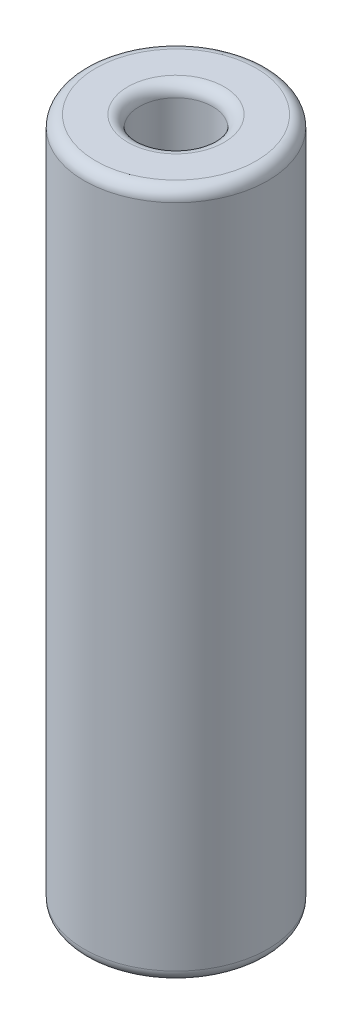
ISO-10303-21;
HEADER;
FILE_DESCRIPTION(('STEP AP214'),'2;1');
FILE_NAME('part.step','',(''),(''),'','','');
FILE_SCHEMA(('AUTOMOTIVE_DESIGN { 1 0 10303 214 1 1 1 1 }'));
ENDSEC;
DATA;
#1=APPLICATION_CONTEXT('core data for automotive mechanical design processes');
#2=APPLICATION_PROTOCOL_DEFINITION('international standard','automotive_design',2000,#1);
#3=PRODUCT_CONTEXT('',#1,'mechanical');
#4=PRODUCT('Part','Part','',(#3));
#5=PRODUCT_RELATED_PRODUCT_CATEGORY('part','',(#4));
#6=PRODUCT_DEFINITION_FORMATION('','',#4);
#7=PRODUCT_DEFINITION_CONTEXT('part definition',#1,'design');
#8=PRODUCT_DEFINITION('design','',#6,#7);
#9=PRODUCT_DEFINITION_SHAPE('','',#8);
#10=(LENGTH_UNIT() NAMED_UNIT(*) SI_UNIT(.MILLI.,.METRE.));
#11=(NAMED_UNIT(*) PLANE_ANGLE_UNIT() SI_UNIT($,.RADIAN.));
#12=(NAMED_UNIT(*) SI_UNIT($,.STERADIAN.) SOLID_ANGLE_UNIT());
#13=UNCERTAINTY_MEASURE_WITH_UNIT(LENGTH_MEASURE(1.E-05),#10,'distance_accuracy_value','');
#14=(GEOMETRIC_REPRESENTATION_CONTEXT(3) GLOBAL_UNCERTAINTY_ASSIGNED_CONTEXT((#13)) GLOBAL_UNIT_ASSIGNED_CONTEXT((#10,
#11,#12)) REPRESENTATION_CONTEXT('',''));
#15=CARTESIAN_POINT('',(0.,0.,0.));
#16=DIRECTION('',(0.,0.,1.));
#17=DIRECTION('',(1.,0.,0.));
#18=AXIS2_PLACEMENT_3D('',#15,#16,#17);
#19=CARTESIAN_POINT('',(0.,38.1,0.));
#20=DIRECTION('',(0.,1.,0.));
#21=DIRECTION('',(0.,0.,1.));
#22=AXIS2_PLACEMENT_3D('',#19,#20,#21);
#23=PLANE('',#22);
#24=CARTESIAN_POINT('',(0.,38.1,0.));
#25=DIRECTION('',(0.,1.,0.));
#26=DIRECTION('',(0.,0.,1.));
#27=AXIS2_PLACEMENT_3D('',#24,#25,#26);
#28=CIRCLE('',#27,2.667);
#29=CARTESIAN_POINT('',(0.,38.1,2.667));
#30=VERTEX_POINT('',#29);
#31=EDGE_CURVE('E10',#30,#30,#28,.F.);
#32=ORIENTED_EDGE('',*,*,#31,.T.);
#33=EDGE_LOOP('',(#32));
#34=FACE_BOUND('',#33,.T.);
#35=CARTESIAN_POINT('',(0.,38.1,0.));
#36=DIRECTION('',(0.,1.,0.));
#37=DIRECTION('',(0.,0.,1.));
#38=AXIS2_PLACEMENT_3D('',#35,#36,#37);
#39=CIRCLE('',#38,4.445);
#40=CARTESIAN_POINT('',(0.,38.1,4.445));
#41=VERTEX_POINT('',#40);
#42=EDGE_CURVE('E38',#41,#41,#39,.T.);
#43=ORIENTED_EDGE('',*,*,#42,.T.);
#44=EDGE_LOOP('',(#43));
#45=FACE_BOUND('',#44,.T.);
#46=ADVANCED_FACE('F31',(#34,#45),#23,.T.);
#47=CARTESIAN_POINT('',(0.,0.,0.));
#48=DIRECTION('',(0.,1.,0.));
#49=DIRECTION('',(0.,0.,1.));
#50=AXIS2_PLACEMENT_3D('',#47,#48,#49);
#51=PLANE('',#50);
#52=CARTESIAN_POINT('',(0.,0.,0.));
#53=DIRECTION('',(0.,1.,0.));
#54=DIRECTION('',(0.,0.,1.));
#55=AXIS2_PLACEMENT_3D('',#52,#53,#54);
#56=CIRCLE('',#55,2.667);
#57=CARTESIAN_POINT('',(0.,0.,2.667));
#58=VERTEX_POINT('',#57);
#59=EDGE_CURVE('E57',#58,#58,#56,.T.);
#60=ORIENTED_EDGE('',*,*,#59,.T.);
#61=EDGE_LOOP('',(#60));
#62=FACE_BOUND('',#61,.T.);
#63=CARTESIAN_POINT('',(0.,0.,0.));
#64=DIRECTION('',(0.,1.,0.));
#65=DIRECTION('',(0.,0.,1.));
#66=AXIS2_PLACEMENT_3D('',#63,#64,#65);
#67=CIRCLE('',#66,4.445);
#68=CARTESIAN_POINT('',(0.,0.,4.445));
#69=VERTEX_POINT('',#68);
#70=EDGE_CURVE('E60',#69,#69,#67,.F.);
#71=ORIENTED_EDGE('',*,*,#70,.T.);
#72=EDGE_LOOP('',(#71));
#73=FACE_BOUND('',#72,.T.);
#74=ADVANCED_FACE('F64',(#62,#73),#51,.F.);
#75=CARTESIAN_POINT('',(0.,38.1,0.));
#76=DIRECTION('',(0.,-1.,0.));
#77=DIRECTION('',(0.,0.,-1.));
#78=AXIS2_PLACEMENT_3D('',#75,#76,#77);
#79=CYLINDRICAL_SURFACE('',#78,5.08);
#80=CARTESIAN_POINT('',(0.,0.634999999999997,0.));
#81=DIRECTION('',(0.,1.,0.));
#82=DIRECTION('',(0.,0.,1.));
#83=AXIS2_PLACEMENT_3D('',#80,#81,#82);
#84=CIRCLE('',#83,5.08);
#85=CARTESIAN_POINT('',(0.,0.634999999999997,-5.08));
#86=VERTEX_POINT('',#85);
#87=EDGE_CURVE('E42',#86,#86,#84,.T.);
#88=CARTESIAN_POINT('',(0.,37.465,0.));
#89=DIRECTION('',(0.,1.,0.));
#90=DIRECTION('',(0.,0.,1.));
#91=AXIS2_PLACEMENT_3D('',#88,#89,#90);
#92=CIRCLE('',#91,5.08);
#93=CARTESIAN_POINT('',(0.,37.465,-5.08));
#94=VERTEX_POINT('',#93);
#95=EDGE_CURVE('E46',#94,#94,#92,.F.);
#96=CARTESIAN_POINT('',(0.,0.634999999999997,-5.08));
#97=CARTESIAN_POINT('',(0.,1.01864583333333,-5.08));
#98=CARTESIAN_POINT('',(0.,1.40229166666666,-5.08));
#99=CARTESIAN_POINT('',(0.,2.16958333333333,-5.08));
#100=CARTESIAN_POINT('',(0.,2.55322916666666,-5.08));
#101=CARTESIAN_POINT('',(0.,3.32052083333333,-5.08));
#102=CARTESIAN_POINT('',(0.,3.70416666666666,-5.08));
#103=CARTESIAN_POINT('',(0.,4.47145833333333,-5.08));
#104=CARTESIAN_POINT('',(0.,4.85510416666667,-5.08));
#105=CARTESIAN_POINT('',(0.,5.62239583333333,-5.08));
#106=CARTESIAN_POINT('',(0.,6.00604166666667,-5.08));
#107=CARTESIAN_POINT('',(0.,6.77333333333333,-5.08));
#108=CARTESIAN_POINT('',(0.,7.15697916666666,-5.08));
#109=CARTESIAN_POINT('',(0.,7.92427083333333,-5.08));
#110=CARTESIAN_POINT('',(0.,8.30791666666666,-5.08));
#111=CARTESIAN_POINT('',(0.,9.07520833333333,-5.08));
#112=CARTESIAN_POINT('',(0.,9.45885416666666,-5.08));
#113=CARTESIAN_POINT('',(0.,10.2261458333333,-5.08));
#114=CARTESIAN_POINT('',(0.,10.6097916666667,-5.08));
#115=CARTESIAN_POINT('',(0.,11.3770833333333,-5.08));
#116=CARTESIAN_POINT('',(0.,11.7607291666667,-5.08));
#117=CARTESIAN_POINT('',(0.,12.5280208333333,-5.08));
#118=CARTESIAN_POINT('',(0.,12.9116666666667,-5.08));
#119=CARTESIAN_POINT('',(0.,13.6789583333333,-5.08));
#120=CARTESIAN_POINT('',(0.,14.0626041666667,-5.08));
#121=CARTESIAN_POINT('',(0.,14.8298958333333,-5.08));
#122=CARTESIAN_POINT('',(0.,15.2135416666667,-5.08));
#123=CARTESIAN_POINT('',(0.,15.9808333333333,-5.08));
#124=CARTESIAN_POINT('',(0.,16.3644791666667,-5.08));
#125=CARTESIAN_POINT('',(0.,17.1317708333333,-5.08));
#126=CARTESIAN_POINT('',(0.,17.5154166666667,-5.08));
#127=CARTESIAN_POINT('',(0.,18.2827083333333,-5.08));
#128=CARTESIAN_POINT('',(0.,18.6663541666667,-5.08));
#129=CARTESIAN_POINT('',(0.,19.4336458333333,-5.08));
#130=CARTESIAN_POINT('',(0.,19.8172916666667,-5.08));
#131=CARTESIAN_POINT('',(0.,20.5845833333333,-5.08));
#132=CARTESIAN_POINT('',(0.,20.9682291666667,-5.08));
#133=CARTESIAN_POINT('',(0.,21.7355208333333,-5.08));
#134=CARTESIAN_POINT('',(0.,22.1191666666667,-5.08));
#135=CARTESIAN_POINT('',(0.,22.8864583333333,-5.08));
#136=CARTESIAN_POINT('',(0.,23.2701041666667,-5.08));
#137=CARTESIAN_POINT('',(0.,24.0373958333333,-5.08));
#138=CARTESIAN_POINT('',(0.,24.4210416666667,-5.08));
#139=CARTESIAN_POINT('',(0.,25.1883333333333,-5.08));
#140=CARTESIAN_POINT('',(0.,25.5719791666667,-5.08));
#141=CARTESIAN_POINT('',(0.,26.3392708333333,-5.08));
#142=CARTESIAN_POINT('',(0.,26.7229166666667,-5.08));
#143=CARTESIAN_POINT('',(0.,27.4902083333333,-5.08));
#144=CARTESIAN_POINT('',(0.,27.8738541666667,-5.08));
#145=CARTESIAN_POINT('',(0.,28.6411458333333,-5.08));
#146=CARTESIAN_POINT('',(0.,29.0247916666667,-5.08));
#147=CARTESIAN_POINT('',(0.,29.7920833333333,-5.08));
#148=CARTESIAN_POINT('',(0.,30.1757291666667,-5.08));
#149=CARTESIAN_POINT('',(0.,30.9430208333333,-5.08));
#150=CARTESIAN_POINT('',(0.,31.3266666666667,-5.08));
#151=CARTESIAN_POINT('',(0.,32.0939583333333,-5.08));
#152=CARTESIAN_POINT('',(0.,32.4776041666667,-5.08));
#153=CARTESIAN_POINT('',(0.,33.2448958333333,-5.08));
#154=CARTESIAN_POINT('',(0.,33.6285416666667,-5.08));
#155=CARTESIAN_POINT('',(0.,34.3958333333333,-5.08));
#156=CARTESIAN_POINT('',(0.,34.7794791666667,-5.08));
#157=CARTESIAN_POINT('',(0.,35.5467708333333,-5.08));
#158=CARTESIAN_POINT('',(0.,35.9304166666667,-5.08));
#159=CARTESIAN_POINT('',(0.,36.6977083333333,-5.08));
#160=CARTESIAN_POINT('',(0.,37.0813541666667,-5.08));
#161=CARTESIAN_POINT('',(0.,37.465,-5.08));
#162=B_SPLINE_CURVE_WITH_KNOTS('',3,(#96,#97,#98,#99,#100,#101,#102,#103,#104,#105,#106,#107,
#108,#109,#110,#111,#112,#113,#114,#115,#116,#117,#118,#119,#120,#121,#122,#123,#124,#125,#126,
#127,#128,#129,#130,#131,#132,#133,#134,#135,#136,#137,#138,#139,#140,#141,#142,#143,#144,#145,
#146,#147,#148,#149,#150,#151,#152,#153,#154,#155,#156,#157,#158,#159,#160,#161),.UNSPECIFIED.,
.F.,.F.,(4,2,2,2,2,2,2,2,2,2,2,2,2,2,2,2,2,2,2,2,2,2,2,2,2,2,2,2,2,2,2,2,4),(0.,1.1509375,
2.301875,3.4528125,4.60375,5.7546875,6.905625,8.0565625,9.2075,10.3584375,11.509375,12.6603125,
13.81125,14.9621875,16.113125,17.2640625,18.415,19.5659375,20.716875,21.8678125,23.01875,
24.1696875,25.320625,26.4715625,27.6225,28.7734375,29.924375,31.0753125,32.22625,33.3771875,
34.528125,35.6790625,36.83),.UNSPECIFIED.);
#163=EDGE_CURVE('BSEAM74',#86,#94,#162,.T.);
#164=ORIENTED_EDGE('',*,*,#87,.T.);
#165=ORIENTED_EDGE('',*,*,#95,.T.);
#166=ORIENTED_EDGE('',*,*,#163,.T.);
#167=ORIENTED_EDGE('',*,*,#163,.F.);
#168=EDGE_LOOP('',(#164,#166,#165,#167));
#169=FACE_BOUND('',#168,.T.);
#170=ADVANCED_FACE('F74',(#169),#79,.T.);
#171=CARTESIAN_POINT('',(0.,38.1,0.));
#172=DIRECTION('',(0.,-1.,0.));
#173=DIRECTION('',(0.,0.,-1.));
#174=AXIS2_PLACEMENT_3D('',#171,#172,#173);
#175=CYLINDRICAL_SURFACE('',#174,2.032);
#176=CARTESIAN_POINT('',(0.,0.634999999999997,0.));
#177=DIRECTION('',(0.,1.,0.));
#178=DIRECTION('',(0.,0.,1.));
#179=AXIS2_PLACEMENT_3D('',#176,#177,#178);
#180=CIRCLE('',#179,2.032);
#181=CARTESIAN_POINT('',(0.,0.634999999999997,-2.032));
#182=VERTEX_POINT('',#181);
#183=EDGE_CURVE('E51',#182,#182,#180,.F.);
#184=CARTESIAN_POINT('',(0.,37.465,0.));
#185=DIRECTION('',(0.,1.,0.));
#186=DIRECTION('',(0.,0.,1.));
#187=AXIS2_PLACEMENT_3D('',#184,#185,#186);
#188=CIRCLE('',#187,2.032);
#189=CARTESIAN_POINT('',(0.,37.465,-2.032));
#190=VERTEX_POINT('',#189);
#191=EDGE_CURVE('E54',#190,#190,#188,.T.);
#192=CARTESIAN_POINT('',(0.,0.634999999999997,-2.032));
#193=CARTESIAN_POINT('',(0.,1.01864583333333,-2.032));
#194=CARTESIAN_POINT('',(0.,1.40229166666666,-2.032));
#195=CARTESIAN_POINT('',(0.,2.16958333333333,-2.032));
#196=CARTESIAN_POINT('',(0.,2.55322916666666,-2.032));
#197=CARTESIAN_POINT('',(0.,3.32052083333333,-2.032));
#198=CARTESIAN_POINT('',(0.,3.70416666666666,-2.032));
#199=CARTESIAN_POINT('',(0.,4.47145833333333,-2.032));
#200=CARTESIAN_POINT('',(0.,4.85510416666667,-2.032));
#201=CARTESIAN_POINT('',(0.,5.62239583333333,-2.032));
#202=CARTESIAN_POINT('',(0.,6.00604166666667,-2.032));
#203=CARTESIAN_POINT('',(0.,6.77333333333333,-2.032));
#204=CARTESIAN_POINT('',(0.,7.15697916666666,-2.032));
#205=CARTESIAN_POINT('',(0.,7.92427083333333,-2.032));
#206=CARTESIAN_POINT('',(0.,8.30791666666666,-2.032));
#207=CARTESIAN_POINT('',(0.,9.07520833333333,-2.032));
#208=CARTESIAN_POINT('',(0.,9.45885416666666,-2.032));
#209=CARTESIAN_POINT('',(0.,10.2261458333333,-2.032));
#210=CARTESIAN_POINT('',(0.,10.6097916666667,-2.032));
#211=CARTESIAN_POINT('',(0.,11.3770833333333,-2.032));
#212=CARTESIAN_POINT('',(0.,11.7607291666667,-2.032));
#213=CARTESIAN_POINT('',(0.,12.5280208333333,-2.032));
#214=CARTESIAN_POINT('',(0.,12.9116666666667,-2.032));
#215=CARTESIAN_POINT('',(0.,13.6789583333333,-2.032));
#216=CARTESIAN_POINT('',(0.,14.0626041666667,-2.032));
#217=CARTESIAN_POINT('',(0.,14.8298958333333,-2.032));
#218=CARTESIAN_POINT('',(0.,15.2135416666667,-2.032));
#219=CARTESIAN_POINT('',(0.,15.9808333333333,-2.032));
#220=CARTESIAN_POINT('',(0.,16.3644791666667,-2.032));
#221=CARTESIAN_POINT('',(0.,17.1317708333333,-2.032));
#222=CARTESIAN_POINT('',(0.,17.5154166666667,-2.032));
#223=CARTESIAN_POINT('',(0.,18.2827083333333,-2.032));
#224=CARTESIAN_POINT('',(0.,18.6663541666667,-2.032));
#225=CARTESIAN_POINT('',(0.,19.4336458333333,-2.032));
#226=CARTESIAN_POINT('',(0.,19.8172916666667,-2.032));
#227=CARTESIAN_POINT('',(0.,20.5845833333333,-2.032));
#228=CARTESIAN_POINT('',(0.,20.9682291666667,-2.032));
#229=CARTESIAN_POINT('',(0.,21.7355208333333,-2.032));
#230=CARTESIAN_POINT('',(0.,22.1191666666667,-2.032));
#231=CARTESIAN_POINT('',(0.,22.8864583333333,-2.032));
#232=CARTESIAN_POINT('',(0.,23.2701041666667,-2.032));
#233=CARTESIAN_POINT('',(0.,24.0373958333333,-2.032));
#234=CARTESIAN_POINT('',(0.,24.4210416666667,-2.032));
#235=CARTESIAN_POINT('',(0.,25.1883333333333,-2.032));
#236=CARTESIAN_POINT('',(0.,25.5719791666667,-2.032));
#237=CARTESIAN_POINT('',(0.,26.3392708333333,-2.032));
#238=CARTESIAN_POINT('',(0.,26.7229166666667,-2.032));
#239=CARTESIAN_POINT('',(0.,27.4902083333333,-2.032));
#240=CARTESIAN_POINT('',(0.,27.8738541666667,-2.032));
#241=CARTESIAN_POINT('',(0.,28.6411458333333,-2.032));
#242=CARTESIAN_POINT('',(0.,29.0247916666667,-2.032));
#243=CARTESIAN_POINT('',(0.,29.7920833333333,-2.032));
#244=CARTESIAN_POINT('',(0.,30.1757291666667,-2.032));
#245=CARTESIAN_POINT('',(0.,30.9430208333333,-2.032));
#246=CARTESIAN_POINT('',(0.,31.3266666666667,-2.032));
#247=CARTESIAN_POINT('',(0.,32.0939583333333,-2.032));
#248=CARTESIAN_POINT('',(0.,32.4776041666667,-2.032));
#249=CARTESIAN_POINT('',(0.,33.2448958333333,-2.032));
#250=CARTESIAN_POINT('',(0.,33.6285416666667,-2.032));
#251=CARTESIAN_POINT('',(0.,34.3958333333333,-2.032));
#252=CARTESIAN_POINT('',(0.,34.7794791666667,-2.032));
#253=CARTESIAN_POINT('',(0.,35.5467708333333,-2.032));
#254=CARTESIAN_POINT('',(0.,35.9304166666667,-2.032));
#255=CARTESIAN_POINT('',(0.,36.6977083333333,-2.032));
#256=CARTESIAN_POINT('',(0.,37.0813541666667,-2.032));
#257=CARTESIAN_POINT('',(0.,37.465,-2.032));
#258=B_SPLINE_CURVE_WITH_KNOTS('',3,(#192,#193,#194,#195,#196,#197,#198,#199,#200,#201,#202,
#203,#204,#205,#206,#207,#208,#209,#210,#211,#212,#213,#214,#215,#216,#217,#218,#219,#220,#221,
#222,#223,#224,#225,#226,#227,#228,#229,#230,#231,#232,#233,#234,#235,#236,#237,#238,#239,#240,
#241,#242,#243,#244,#245,#246,#247,#248,#249,#250,#251,#252,#253,#254,#255,#256,#257),
.UNSPECIFIED.,.F.,.F.,(4,2,2,2,2,2,2,2,2,2,2,2,2,2,2,2,2,2,2,2,2,2,2,2,2,2,2,2,2,2,2,2,4),(0.,
1.1509375,2.301875,3.4528125,4.60375,5.7546875,6.905625,8.0565625,9.2075,10.3584375,11.509375,
12.6603125,13.81125,14.9621875,16.113125,17.2640625,18.415,19.5659375,20.716875,21.8678125,
23.01875,24.1696875,25.320625,26.4715625,27.6225,28.7734375,29.924375,31.0753125,32.22625,
33.3771875,34.528125,35.6790625,36.83),.UNSPECIFIED.);
#259=EDGE_CURVE('BSEAM77',#182,#190,#258,.T.);
#260=ORIENTED_EDGE('',*,*,#183,.T.);
#261=ORIENTED_EDGE('',*,*,#191,.T.);
#262=ORIENTED_EDGE('',*,*,#259,.T.);
#263=ORIENTED_EDGE('',*,*,#259,.F.);
#264=EDGE_LOOP('',(#260,#262,#261,#263));
#265=FACE_BOUND('',#264,.T.);
#266=ADVANCED_FACE('F77',(#265),#175,.F.);
#267=CARTESIAN_POINT('',(0.,0.634999999999997,0.));
#268=DIRECTION('',(0.,1.,0.));
#269=DIRECTION('',(0.,0.,1.));
#270=AXIS2_PLACEMENT_3D('',#267,#268,#269);
#271=TOROIDAL_SURFACE('',#270,2.667,0.635);
#272=ORIENTED_EDGE('',*,*,#183,.F.);
#273=EDGE_LOOP('',(#272));
#274=FACE_BOUND('',#273,.T.);
#275=ORIENTED_EDGE('',*,*,#59,.F.);
#276=EDGE_LOOP('',(#275));
#277=FACE_BOUND('',#276,.T.);
#278=ADVANCED_FACE('F70',(#274,#277),#271,.T.);
#279=CARTESIAN_POINT('',(0.,0.634999999999997,0.));
#280=DIRECTION('',(0.,1.,0.));
#281=DIRECTION('',(0.,0.,1.));
#282=AXIS2_PLACEMENT_3D('',#279,#280,#281);
#283=TOROIDAL_SURFACE('',#282,4.445,0.635);
#284=ORIENTED_EDGE('',*,*,#70,.F.);
#285=EDGE_LOOP('',(#284));
#286=FACE_BOUND('',#285,.T.);
#287=ORIENTED_EDGE('',*,*,#87,.F.);
#288=EDGE_LOOP('',(#287));
#289=FACE_BOUND('',#288,.T.);
#290=ADVANCED_FACE('F66',(#286,#289),#283,.T.);
#291=CARTESIAN_POINT('',(0.,37.465,0.));
#292=DIRECTION('',(0.,1.,0.));
#293=DIRECTION('',(0.,0.,1.));
#294=AXIS2_PLACEMENT_3D('',#291,#292,#293);
#295=TOROIDAL_SURFACE('',#294,2.667,0.635);
#296=ORIENTED_EDGE('',*,*,#31,.F.);
#297=EDGE_LOOP('',(#296));
#298=FACE_BOUND('',#297,.T.);
#299=ORIENTED_EDGE('',*,*,#191,.F.);
#300=EDGE_LOOP('',(#299));
#301=FACE_BOUND('',#300,.T.);
#302=ADVANCED_FACE('F69',(#298,#301),#295,.T.);
#303=CARTESIAN_POINT('',(0.,37.465,0.));
#304=DIRECTION('',(0.,1.,0.));
#305=DIRECTION('',(0.,0.,1.));
#306=AXIS2_PLACEMENT_3D('',#303,#304,#305);
#307=TOROIDAL_SURFACE('',#306,4.445,0.635);
#308=ORIENTED_EDGE('',*,*,#95,.F.);
#309=EDGE_LOOP('',(#308));
#310=FACE_BOUND('',#309,.T.);
#311=ORIENTED_EDGE('',*,*,#42,.F.);
#312=EDGE_LOOP('',(#311));
#313=FACE_BOUND('',#312,.T.);
#314=ADVANCED_FACE('F33',(#310,#313),#307,.T.);
#315=CLOSED_SHELL('',(#46,#74,#170,#266,#278,#290,#302,#314));
#316=MANIFOLD_SOLID_BREP('B2',#315);
#317=ADVANCED_BREP_SHAPE_REPRESENTATION('',(#18,#316),#14);
#318=SHAPE_DEFINITION_REPRESENTATION(#9,#317);
ENDSEC;
END-ISO-10303-21;
